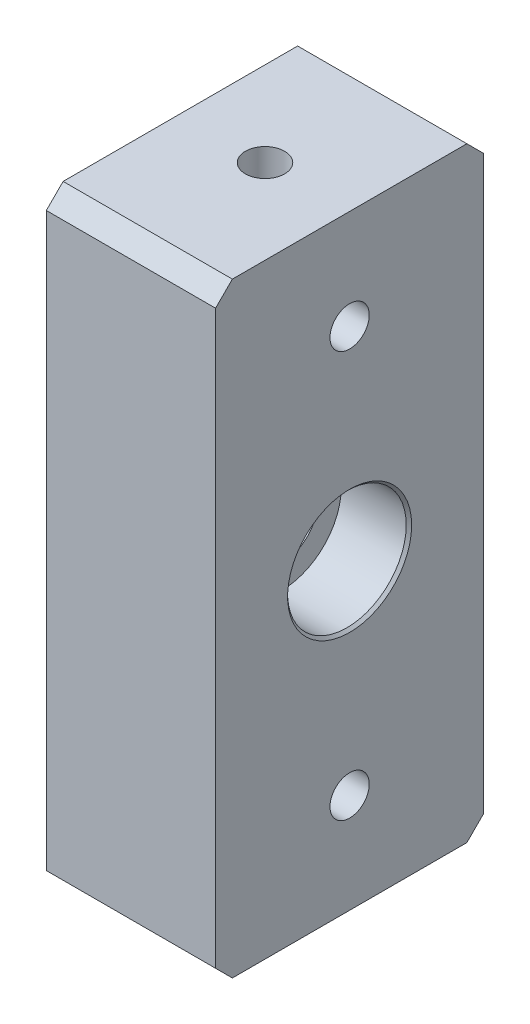
ISO-10303-21;
HEADER;
FILE_DESCRIPTION(('STEP AP214'),'2;1');
FILE_NAME('part.step','',(''),(''),'','','');
FILE_SCHEMA(('AUTOMOTIVE_DESIGN { 1 0 10303 214 1 1 1 1 }'));
ENDSEC;
DATA;
#1=APPLICATION_CONTEXT('core data for automotive mechanical design processes');
#2=APPLICATION_PROTOCOL_DEFINITION('international standard','automotive_design',2000,#1);
#3=PRODUCT_CONTEXT('',#1,'mechanical');
#4=PRODUCT('Part','Part','',(#3));
#5=PRODUCT_RELATED_PRODUCT_CATEGORY('part','',(#4));
#6=PRODUCT_DEFINITION_FORMATION('','',#4);
#7=PRODUCT_DEFINITION_CONTEXT('part definition',#1,'design');
#8=PRODUCT_DEFINITION('design','',#6,#7);
#9=PRODUCT_DEFINITION_SHAPE('','',#8);
#10=(LENGTH_UNIT() NAMED_UNIT(*) SI_UNIT(.MILLI.,.METRE.));
#11=(NAMED_UNIT(*) PLANE_ANGLE_UNIT() SI_UNIT($,.RADIAN.));
#12=(NAMED_UNIT(*) SI_UNIT($,.STERADIAN.) SOLID_ANGLE_UNIT());
#13=UNCERTAINTY_MEASURE_WITH_UNIT(LENGTH_MEASURE(1.E-05),#10,'distance_accuracy_value','');
#14=(GEOMETRIC_REPRESENTATION_CONTEXT(3) GLOBAL_UNCERTAINTY_ASSIGNED_CONTEXT((#13)) GLOBAL_UNIT_ASSIGNED_CONTEXT((#10,
#11,#12)) REPRESENTATION_CONTEXT('',''));
#15=CARTESIAN_POINT('',(0.,0.,0.));
#16=DIRECTION('',(0.,0.,1.));
#17=DIRECTION('',(1.,0.,0.));
#18=AXIS2_PLACEMENT_3D('',#15,#16,#17);
#19=CARTESIAN_POINT('',(7.9375,57.15,12.573));
#20=DIRECTION('',(0.,1.,0.));
#21=DIRECTION('',(0.,0.,1.));
#22=AXIS2_PLACEMENT_3D('',#19,#20,#21);
#23=CYLINDRICAL_SURFACE('',#22,1.8415);
#24=CARTESIAN_POINT('',(7.9375,57.15,12.573));
#25=DIRECTION('',(0.,1.,0.));
#26=DIRECTION('',(0.,0.,1.));
#27=AXIS2_PLACEMENT_3D('',#24,#25,#26);
#28=CIRCLE('',#27,1.8415);
#29=CARTESIAN_POINT('',(7.9375,57.15,14.4145));
#30=VERTEX_POINT('',#29);
#31=EDGE_CURVE('E147',#30,#30,#28,.T.);
#32=ORIENTED_EDGE('',*,*,#31,.T.);
#33=EDGE_LOOP('',(#32));
#34=FACE_BOUND('',#33,.T.);
#35=CARTESIAN_POINT('',(7.9375,47.8155,12.573));
#36=DIRECTION('',(-0.707106781186547,0.707106781186547,0.));
#37=DIRECTION('',(0.707106781186547,0.707106781186547,0.));
#38=AXIS2_PLACEMENT_3D('',#35,#36,#37);
#39=ELLIPSE('',#38,2.60427427511007,1.84150000000001);
#40=CARTESIAN_POINT('',(7.9375,47.8155,10.7315));
#41=VERTEX_POINT('',#40);
#42=CARTESIAN_POINT('',(7.9375,47.8155,14.4145));
#43=VERTEX_POINT('',#42);
#44=EDGE_CURVE('E128',#41,#43,#39,.F.);
#45=ORIENTED_EDGE('',*,*,#44,.T.);
#46=CARTESIAN_POINT('',(7.9375,47.8155,12.573));
#47=DIRECTION('',(0.707106781186547,0.707106781186547,0.));
#48=DIRECTION('',(-0.707106781186547,0.707106781186547,0.));
#49=AXIS2_PLACEMENT_3D('',#46,#47,#48);
#50=ELLIPSE('',#49,2.60427427511007,1.84150000000001);
#51=EDGE_CURVE('E124',#43,#41,#50,.F.);
#52=ORIENTED_EDGE('',*,*,#51,.T.);
#53=EDGE_LOOP('',(#45,#52));
#54=FACE_BOUND('',#53,.T.);
#55=ADVANCED_FACE('F35',(#34,#54),#23,.F.);
#56=CARTESIAN_POINT('',(7.9375,0.381,12.573));
#57=DIRECTION('',(0.,-1.,0.));
#58=DIRECTION('',(0.,0.,-1.));
#59=AXIS2_PLACEMENT_3D('',#56,#57,#58);
#60=CYLINDRICAL_SURFACE('',#59,1.8415);
#61=CARTESIAN_POINT('',(7.9375,0.380999999999999,12.573));
#62=DIRECTION('',(0.,-1.,0.));
#63=DIRECTION('',(0.,0.,-1.));
#64=AXIS2_PLACEMENT_3D('',#61,#62,#63);
#65=CIRCLE('',#64,1.8415);
#66=CARTESIAN_POINT('',(7.9375,0.380999999999999,10.7315));
#67=VERTEX_POINT('',#66);
#68=EDGE_CURVE('E153',#67,#67,#65,.T.);
#69=ORIENTED_EDGE('',*,*,#68,.T.);
#70=EDGE_LOOP('',(#69));
#71=FACE_BOUND('',#70,.T.);
#72=CARTESIAN_POINT('',(7.9375,9.7155,12.573));
#73=DIRECTION('',(-0.707106781186547,-0.707106781186547,0.));
#74=DIRECTION('',(0.707106781186547,-0.707106781186547,0.));
#75=AXIS2_PLACEMENT_3D('',#72,#73,#74);
#76=ELLIPSE('',#75,2.60427427511006,1.84150000000001);
#77=CARTESIAN_POINT('',(7.9375,9.7155,14.4145));
#78=VERTEX_POINT('',#77);
#79=CARTESIAN_POINT('',(7.9375,9.7155,10.7315));
#80=VERTEX_POINT('',#79);
#81=EDGE_CURVE('E172',#78,#80,#76,.F.);
#82=ORIENTED_EDGE('',*,*,#81,.T.);
#83=CARTESIAN_POINT('',(7.9375,9.7155,12.573));
#84=DIRECTION('',(0.707106781186547,-0.707106781186547,0.));
#85=DIRECTION('',(-0.707106781186547,-0.707106781186547,0.));
#86=AXIS2_PLACEMENT_3D('',#83,#84,#85);
#87=ELLIPSE('',#86,2.60427427511006,1.84150000000001);
#88=EDGE_CURVE('E190',#80,#78,#87,.F.);
#89=ORIENTED_EDGE('',*,*,#88,.T.);
#90=EDGE_LOOP('',(#82,#89));
#91=FACE_BOUND('',#90,.T.);
#92=ADVANCED_FACE('F251',(#71,#91),#60,.F.);
#93=CARTESIAN_POINT('',(0.,57.15,0.));
#94=DIRECTION('',(0.,1.,0.));
#95=DIRECTION('',(0.,0.,1.));
#96=AXIS2_PLACEMENT_3D('',#93,#94,#95);
#97=PLANE('',#96);
#98=ORIENTED_EDGE('',*,*,#31,.F.);
#99=EDGE_LOOP('',(#98));
#100=FACE_BOUND('',#99,.T.);
#101=DIRECTION('',(0.,0.,1.));
#102=VECTOR('',#101,1.);
#103=CARTESIAN_POINT('',(0.,57.15,0.));
#104=LINE('',#103,#102);
#105=CARTESIAN_POINT('',(0.,57.15,1.5748));
#106=VERTEX_POINT('',#105);
#107=CARTESIAN_POINT('',(0.,57.15,23.5712));
#108=VERTEX_POINT('',#107);
#109=EDGE_CURVE('E160',#106,#108,#104,.T.);
#110=ORIENTED_EDGE('',*,*,#109,.T.);
#111=DIRECTION('',(1.,0.,0.));
#112=VECTOR('',#111,1.);
#113=CARTESIAN_POINT('',(0.,57.15,23.5712));
#114=LINE('',#113,#112);
#115=CARTESIAN_POINT('',(15.875,57.15,23.5712));
#116=VERTEX_POINT('',#115);
#117=EDGE_CURVE('E198',#108,#116,#114,.T.);
#118=ORIENTED_EDGE('',*,*,#117,.T.);
#119=DIRECTION('',(0.,0.,1.));
#120=VECTOR('',#119,1.);
#121=CARTESIAN_POINT('',(15.875,57.15,0.));
#122=LINE('',#121,#120);
#123=CARTESIAN_POINT('',(15.875,57.15,1.5748));
#124=VERTEX_POINT('',#123);
#125=EDGE_CURVE('E159',#124,#116,#122,.T.);
#126=ORIENTED_EDGE('',*,*,#125,.F.);
#127=DIRECTION('',(-1.,0.,0.));
#128=VECTOR('',#127,1.);
#129=CARTESIAN_POINT('',(0.,57.15,1.5748));
#130=LINE('',#129,#128);
#131=EDGE_CURVE('E193',#124,#106,#130,.T.);
#132=ORIENTED_EDGE('',*,*,#131,.T.);
#133=EDGE_LOOP('',(#110,#118,#126,#132));
#134=FACE_BOUND('',#133,.T.);
#135=ADVANCED_FACE('F257',(#100,#134),#97,.T.);
#136=CARTESIAN_POINT('',(0.,0.380999999999999,0.));
#137=DIRECTION('',(0.,0.,-1.));
#138=DIRECTION('',(-1.,0.,0.));
#139=AXIS2_PLACEMENT_3D('',#136,#137,#138);
#140=PLANE('',#139);
#141=DIRECTION('',(0.,1.,0.));
#142=VECTOR('',#141,1.);
#143=CARTESIAN_POINT('',(0.,0.380999999999999,0.));
#144=LINE('',#143,#142);
#145=CARTESIAN_POINT('',(0.,1.95580000000001,0.));
#146=VERTEX_POINT('',#145);
#147=CARTESIAN_POINT('',(0.,55.5752,0.));
#148=VERTEX_POINT('',#147);
#149=EDGE_CURVE('E169',#146,#148,#144,.T.);
#150=ORIENTED_EDGE('',*,*,#149,.T.);
#151=DIRECTION('',(1.,0.,0.));
#152=VECTOR('',#151,1.);
#153=CARTESIAN_POINT('',(0.,55.5752,0.));
#154=LINE('',#153,#152);
#155=CARTESIAN_POINT('',(15.875,55.5752,0.));
#156=VERTEX_POINT('',#155);
#157=EDGE_CURVE('E223',#148,#156,#154,.T.);
#158=ORIENTED_EDGE('',*,*,#157,.T.);
#159=DIRECTION('',(0.,1.,0.));
#160=VECTOR('',#159,1.);
#161=CARTESIAN_POINT('',(15.875,0.380999999999999,0.));
#162=LINE('',#161,#160);
#163=CARTESIAN_POINT('',(15.875,1.95580000000001,0.));
#164=VERTEX_POINT('',#163);
#165=EDGE_CURVE('E164',#164,#156,#162,.T.);
#166=ORIENTED_EDGE('',*,*,#165,.F.);
#167=DIRECTION('',(-1.,0.,0.));
#168=VECTOR('',#167,1.);
#169=CARTESIAN_POINT('',(0.,1.95580000000001,0.));
#170=LINE('',#169,#168);
#171=EDGE_CURVE('E221',#164,#146,#170,.T.);
#172=ORIENTED_EDGE('',*,*,#171,.T.);
#173=EDGE_LOOP('',(#150,#158,#166,#172));
#174=FACE_BOUND('',#173,.T.);
#175=ADVANCED_FACE('F298',(#174),#140,.T.);
#176=CARTESIAN_POINT('',(0.,0.381,25.146));
#177=DIRECTION('',(0.,-1.,0.));
#178=DIRECTION('',(0.,0.,-1.));
#179=AXIS2_PLACEMENT_3D('',#176,#177,#178);
#180=PLANE('',#179);
#181=ORIENTED_EDGE('',*,*,#68,.F.);
#182=EDGE_LOOP('',(#181));
#183=FACE_BOUND('',#182,.T.);
#184=DIRECTION('',(0.,0.,-1.));
#185=VECTOR('',#184,1.);
#186=CARTESIAN_POINT('',(0.,0.381,25.146));
#187=LINE('',#186,#185);
#188=CARTESIAN_POINT('',(0.,0.381,23.5712));
#189=VERTEX_POINT('',#188);
#190=CARTESIAN_POINT('',(0.,0.380999999999999,1.5748));
#191=VERTEX_POINT('',#190);
#192=EDGE_CURVE('E167',#189,#191,#187,.T.);
#193=ORIENTED_EDGE('',*,*,#192,.T.);
#194=DIRECTION('',(1.,0.,0.));
#195=VECTOR('',#194,1.);
#196=CARTESIAN_POINT('',(0.,0.380999999999999,1.5748));
#197=LINE('',#196,#195);
#198=CARTESIAN_POINT('',(15.875,0.380999999999999,1.5748));
#199=VERTEX_POINT('',#198);
#200=EDGE_CURVE('E227',#191,#199,#197,.T.);
#201=ORIENTED_EDGE('',*,*,#200,.T.);
#202=DIRECTION('',(0.,0.,-1.));
#203=VECTOR('',#202,1.);
#204=CARTESIAN_POINT('',(15.875,0.381,25.146));
#205=LINE('',#204,#203);
#206=CARTESIAN_POINT('',(15.875,0.381,23.5712));
#207=VERTEX_POINT('',#206);
#208=EDGE_CURVE('E178',#207,#199,#205,.T.);
#209=ORIENTED_EDGE('',*,*,#208,.F.);
#210=DIRECTION('',(-1.,0.,0.));
#211=VECTOR('',#210,1.);
#212=CARTESIAN_POINT('',(0.,0.381,23.5712));
#213=LINE('',#212,#211);
#214=EDGE_CURVE('E57',#207,#189,#213,.T.);
#215=ORIENTED_EDGE('',*,*,#214,.T.);
#216=EDGE_LOOP('',(#193,#201,#209,#215));
#217=FACE_BOUND('',#216,.T.);
#218=ADVANCED_FACE('F301',(#183,#217),#180,.T.);
#219=CARTESIAN_POINT('',(0.,57.15,25.146));
#220=DIRECTION('',(0.,0.,1.));
#221=DIRECTION('',(1.,0.,0.));
#222=AXIS2_PLACEMENT_3D('',#219,#220,#221);
#223=PLANE('',#222);
#224=DIRECTION('',(0.,-1.,0.));
#225=VECTOR('',#224,1.);
#226=CARTESIAN_POINT('',(15.875,57.15,25.146));
#227=LINE('',#226,#225);
#228=CARTESIAN_POINT('',(15.875,55.5752,25.146));
#229=VERTEX_POINT('',#228);
#230=CARTESIAN_POINT('',(15.875,1.9558,25.146));
#231=VERTEX_POINT('',#230);
#232=EDGE_CURVE('E175',#229,#231,#227,.T.);
#233=ORIENTED_EDGE('',*,*,#232,.F.);
#234=DIRECTION('',(-1.,0.,0.));
#235=VECTOR('',#234,1.);
#236=CARTESIAN_POINT('',(0.,55.5752,25.146));
#237=LINE('',#236,#235);
#238=CARTESIAN_POINT('',(0.,55.5752,25.146));
#239=VERTEX_POINT('',#238);
#240=EDGE_CURVE('E212',#229,#239,#237,.T.);
#241=ORIENTED_EDGE('',*,*,#240,.T.);
#242=DIRECTION('',(0.,-1.,0.));
#243=VECTOR('',#242,1.);
#244=CARTESIAN_POINT('',(0.,57.15,25.146));
#245=LINE('',#244,#243);
#246=CARTESIAN_POINT('',(0.,1.9558,25.146));
#247=VERTEX_POINT('',#246);
#248=EDGE_CURVE('E163',#239,#247,#245,.T.);
#249=ORIENTED_EDGE('',*,*,#248,.T.);
#250=DIRECTION('',(1.,0.,0.));
#251=VECTOR('',#250,1.);
#252=CARTESIAN_POINT('',(0.,1.9558,25.146));
#253=LINE('',#252,#251);
#254=EDGE_CURVE('E209',#247,#231,#253,.T.);
#255=ORIENTED_EDGE('',*,*,#254,.T.);
#256=EDGE_LOOP('',(#233,#241,#249,#255));
#257=FACE_BOUND('',#256,.T.);
#258=ADVANCED_FACE('F293',(#257),#223,.T.);
#259=CARTESIAN_POINT('',(0.,0.,0.));
#260=DIRECTION('',(1.,0.,0.));
#261=DIRECTION('',(0.,0.,-1.));
#262=AXIS2_PLACEMENT_3D('',#259,#260,#261);
#263=PLANE('',#262);
#264=CARTESIAN_POINT('',(0.,28.7655,12.573));
#265=DIRECTION('',(1.,0.,0.));
#266=DIRECTION('',(0.,0.,-1.));
#267=AXIS2_PLACEMENT_3D('',#264,#265,#266);
#268=CIRCLE('',#267,3.63220000021137);
#269=CARTESIAN_POINT('',(0.,28.7655,16.2052000002114));
#270=VERTEX_POINT('',#269);
#271=EDGE_CURVE('E230',#270,#270,#268,.T.);
#272=ORIENTED_EDGE('',*,*,#271,.T.);
#273=EDGE_LOOP('',(#272));
#274=FACE_BOUND('',#273,.T.);
#275=CARTESIAN_POINT('',(0.,47.8155,12.573));
#276=DIRECTION('',(1.,0.,0.));
#277=DIRECTION('',(0.,0.,-1.));
#278=AXIS2_PLACEMENT_3D('',#275,#276,#277);
#279=CIRCLE('',#278,1.84150000000002);
#280=CARTESIAN_POINT('',(0.,47.8155,10.7315));
#281=VERTEX_POINT('',#280);
#282=EDGE_CURVE('E134',#281,#281,#279,.T.);
#283=ORIENTED_EDGE('',*,*,#282,.T.);
#284=EDGE_LOOP('',(#283));
#285=FACE_BOUND('',#284,.T.);
#286=CARTESIAN_POINT('',(0.,9.7155,12.573));
#287=DIRECTION('',(1.,0.,0.));
#288=DIRECTION('',(0.,0.,-1.));
#289=AXIS2_PLACEMENT_3D('',#286,#287,#288);
#290=CIRCLE('',#289,1.84150000000002);
#291=CARTESIAN_POINT('',(0.,9.7155,10.7315));
#292=VERTEX_POINT('',#291);
#293=EDGE_CURVE('E144',#292,#292,#290,.T.);
#294=ORIENTED_EDGE('',*,*,#293,.T.);
#295=EDGE_LOOP('',(#294));
#296=FACE_BOUND('',#295,.T.);
#297=ORIENTED_EDGE('',*,*,#248,.F.);
#298=DIRECTION('',(0.,-0.707106781186551,0.707106781186544));
#299=VECTOR('',#298,1.);
#300=CARTESIAN_POINT('',(0.,57.15,23.5712));
#301=LINE('',#300,#299);
#302=EDGE_CURVE('E219',#239,#108,#301,.F.);
#303=ORIENTED_EDGE('',*,*,#302,.T.);
#304=ORIENTED_EDGE('',*,*,#109,.F.);
#305=DIRECTION('',(0.,0.707106781186544,0.707106781186551));
#306=VECTOR('',#305,1.);
#307=CARTESIAN_POINT('',(0.,55.5752,0.));
#308=LINE('',#307,#306);
#309=EDGE_CURVE('E217',#106,#148,#308,.F.);
#310=ORIENTED_EDGE('',*,*,#309,.T.);
#311=ORIENTED_EDGE('',*,*,#149,.F.);
#312=DIRECTION('',(0.,0.707106781186551,-0.707106781186544));
#313=VECTOR('',#312,1.);
#314=CARTESIAN_POINT('',(0.,0.380999999999999,1.5748));
#315=LINE('',#314,#313);
#316=EDGE_CURVE('E50',#146,#191,#315,.F.);
#317=ORIENTED_EDGE('',*,*,#316,.T.);
#318=ORIENTED_EDGE('',*,*,#192,.F.);
#319=DIRECTION('',(0.,-0.707106781186544,-0.707106781186551));
#320=VECTOR('',#319,1.);
#321=CARTESIAN_POINT('',(0.,1.9558,25.146));
#322=LINE('',#321,#320);
#323=EDGE_CURVE('E214',#189,#247,#322,.F.);
#324=ORIENTED_EDGE('',*,*,#323,.T.);
#325=EDGE_LOOP('',(#297,#303,#304,#310,#311,#317,#318,#324));
#326=FACE_BOUND('',#325,.T.);
#327=ADVANCED_FACE('F289',(#274,#285,#296,#326),#263,.F.);
#328=CARTESIAN_POINT('',(15.875,0.,0.));
#329=DIRECTION('',(1.,0.,0.));
#330=DIRECTION('',(0.,0.,-1.));
#331=AXIS2_PLACEMENT_3D('',#328,#329,#330);
#332=PLANE('',#331);
#333=CARTESIAN_POINT('',(15.875,28.7655,12.573));
#334=DIRECTION('',(1.,0.,0.));
#335=DIRECTION('',(0.,0.,-1.));
#336=AXIS2_PLACEMENT_3D('',#333,#334,#335);
#337=CIRCLE('',#336,5.81659999975662);
#338=CARTESIAN_POINT('',(15.875,28.7655,6.75640000024338));
#339=VERTEX_POINT('',#338);
#340=EDGE_CURVE('E11',#339,#339,#337,.F.);
#341=ORIENTED_EDGE('',*,*,#340,.T.);
#342=EDGE_LOOP('',(#341));
#343=FACE_BOUND('',#342,.T.);
#344=CARTESIAN_POINT('',(15.875,47.8155,12.573));
#345=DIRECTION('',(1.,0.,0.));
#346=DIRECTION('',(0.,0.,-1.));
#347=AXIS2_PLACEMENT_3D('',#344,#345,#346);
#348=CIRCLE('',#347,1.84150000000002);
#349=CARTESIAN_POINT('',(15.875,47.8155,10.7315));
#350=VERTEX_POINT('',#349);
#351=EDGE_CURVE('E196',#350,#350,#348,.T.);
#352=ORIENTED_EDGE('',*,*,#351,.F.);
#353=EDGE_LOOP('',(#352));
#354=FACE_BOUND('',#353,.T.);
#355=CARTESIAN_POINT('',(15.875,9.7155,12.573));
#356=DIRECTION('',(1.,0.,0.));
#357=DIRECTION('',(0.,0.,-1.));
#358=AXIS2_PLACEMENT_3D('',#355,#356,#357);
#359=CIRCLE('',#358,1.84150000000002);
#360=CARTESIAN_POINT('',(15.875,9.7155,10.7315));
#361=VERTEX_POINT('',#360);
#362=EDGE_CURVE('E136',#361,#361,#359,.T.);
#363=ORIENTED_EDGE('',*,*,#362,.F.);
#364=EDGE_LOOP('',(#363));
#365=FACE_BOUND('',#364,.T.);
#366=ORIENTED_EDGE('',*,*,#125,.T.);
#367=DIRECTION('',(0.,0.707106781186551,-0.707106781186544));
#368=VECTOR('',#367,1.);
#369=CARTESIAN_POINT('',(15.875,40.3605999999998,40.3606000000001));
#370=LINE('',#369,#368);
#371=EDGE_CURVE('E207',#116,#229,#370,.F.);
#372=ORIENTED_EDGE('',*,*,#371,.T.);
#373=ORIENTED_EDGE('',*,*,#232,.T.);
#374=DIRECTION('',(0.,0.707106781186544,0.707106781186551));
#375=VECTOR('',#374,1.);
#376=CARTESIAN_POINT('',(15.875,-11.5951,11.5950999999999));
#377=LINE('',#376,#375);
#378=EDGE_CURVE('E201',#231,#207,#377,.F.);
#379=ORIENTED_EDGE('',*,*,#378,.T.);
#380=ORIENTED_EDGE('',*,*,#208,.T.);
#381=DIRECTION('',(0.,-0.707106781186551,0.707106781186544));
#382=VECTOR('',#381,1.);
#383=CARTESIAN_POINT('',(15.875,0.977899999999999,0.977900000000007));
#384=LINE('',#383,#382);
#385=EDGE_CURVE('E203',#199,#164,#384,.F.);
#386=ORIENTED_EDGE('',*,*,#385,.T.);
#387=ORIENTED_EDGE('',*,*,#165,.T.);
#388=DIRECTION('',(0.,-0.707106781186544,-0.707106781186551));
#389=VECTOR('',#388,1.);
#390=CARTESIAN_POINT('',(15.875,27.7876000000003,-27.7876));
#391=LINE('',#390,#389);
#392=EDGE_CURVE('E205',#156,#124,#391,.F.);
#393=ORIENTED_EDGE('',*,*,#392,.T.);
#394=EDGE_LOOP('',(#366,#372,#373,#379,#380,#386,#387,#393));
#395=FACE_BOUND('',#394,.T.);
#396=ADVANCED_FACE('F292',(#343,#354,#365,#395),#332,.T.);
#397=CARTESIAN_POINT('',(15.875,9.7155,12.573));
#398=DIRECTION('',(1.,0.,0.));
#399=DIRECTION('',(0.,0.,-1.));
#400=AXIS2_PLACEMENT_3D('',#397,#398,#399);
#401=CYLINDRICAL_SURFACE('',#400,1.84150000000002);
#402=ORIENTED_EDGE('',*,*,#362,.T.);
#403=EDGE_LOOP('',(#402));
#404=FACE_BOUND('',#403,.T.);
#405=ORIENTED_EDGE('',*,*,#81,.F.);
#406=CARTESIAN_POINT('',(7.9375,9.7155,12.573));
#407=DIRECTION('',(0.707106781186547,-0.707106781186547,0.));
#408=DIRECTION('',(-0.707106781186547,-0.707106781186547,0.));
#409=AXIS2_PLACEMENT_3D('',#406,#407,#408);
#410=ELLIPSE('',#409,2.60427427511006,1.84150000000001);
#411=EDGE_CURVE('E187',#80,#78,#410,.T.);
#412=ORIENTED_EDGE('',*,*,#411,.F.);
#413=EDGE_LOOP('',(#405,#412));
#414=FACE_BOUND('',#413,.T.);
#415=ADVANCED_FACE('F287',(#404,#414),#401,.F.);
#416=CARTESIAN_POINT('',(7.9375,13.081,12.573));
#417=DIRECTION('',(0.,-1.,0.));
#418=DIRECTION('',(0.,0.,-1.));
#419=AXIS2_PLACEMENT_3D('',#416,#417,#418);
#420=CONICAL_SURFACE('',#419,1.8415,1.02974425741709);
#421=CARTESIAN_POINT('',(7.9375,14.1874848330962,12.573));
#422=VERTEX_POINT('',#421);
#423=VERTEX_LOOP('',#422);
#424=FACE_BOUND('',#423,.T.);
#425=CARTESIAN_POINT('',(7.9375,13.081,12.573));
#426=DIRECTION('',(0.,-1.,0.));
#427=DIRECTION('',(0.,0.,-1.));
#428=AXIS2_PLACEMENT_3D('',#425,#426,#427);
#429=CIRCLE('',#428,1.8415);
#430=CARTESIAN_POINT('',(7.9375,13.081,10.7315));
#431=VERTEX_POINT('',#430);
#432=EDGE_CURVE('E156',#431,#431,#429,.T.);
#433=ORIENTED_EDGE('',*,*,#432,.T.);
#434=EDGE_LOOP('',(#433));
#435=FACE_BOUND('',#434,.T.);
#436=ADVANCED_FACE('F283',(#424,#435),#420,.F.);
#437=CARTESIAN_POINT('',(7.9375,9.7155,12.573));
#438=DIRECTION('',(-0.707106781186547,-0.707106781186547,0.));
#439=DIRECTION('',(0.707106781186547,-0.707106781186547,0.));
#440=AXIS2_PLACEMENT_3D('',#437,#438,#439);
#441=ELLIPSE('',#440,2.60427427511006,1.84150000000001);
#442=EDGE_CURVE('E184',#78,#80,#441,.T.);
#443=ORIENTED_EDGE('',*,*,#442,.T.);
#444=ORIENTED_EDGE('',*,*,#411,.T.);
#445=EDGE_LOOP('',(#443,#444));
#446=FACE_BOUND('',#445,.T.);
#447=ORIENTED_EDGE('',*,*,#432,.F.);
#448=EDGE_LOOP('',(#447));
#449=FACE_BOUND('',#448,.T.);
#450=ADVANCED_FACE('F260',(#446,#449),#60,.F.);
#451=ORIENTED_EDGE('',*,*,#442,.F.);
#452=ORIENTED_EDGE('',*,*,#88,.F.);
#453=EDGE_LOOP('',(#451,#452));
#454=FACE_BOUND('',#453,.T.);
#455=ORIENTED_EDGE('',*,*,#293,.F.);
#456=EDGE_LOOP('',(#455));
#457=FACE_BOUND('',#456,.T.);
#458=ADVANCED_FACE('F282',(#454,#457),#401,.F.);
#459=CARTESIAN_POINT('',(15.875,47.8155,12.573));
#460=DIRECTION('',(1.,0.,0.));
#461=DIRECTION('',(0.,0.,-1.));
#462=AXIS2_PLACEMENT_3D('',#459,#460,#461);
#463=CYLINDRICAL_SURFACE('',#462,1.84150000000002);
#464=ORIENTED_EDGE('',*,*,#282,.F.);
#465=EDGE_LOOP('',(#464));
#466=FACE_BOUND('',#465,.T.);
#467=CARTESIAN_POINT('',(7.9375,47.8155,12.573));
#468=DIRECTION('',(-0.707106781186547,0.707106781186547,0.));
#469=DIRECTION('',(0.707106781186547,0.707106781186547,0.));
#470=AXIS2_PLACEMENT_3D('',#467,#468,#469);
#471=ELLIPSE('',#470,2.60427427511007,1.84150000000001);
#472=EDGE_CURVE('E120',#41,#43,#471,.T.);
#473=ORIENTED_EDGE('',*,*,#472,.F.);
#474=ORIENTED_EDGE('',*,*,#51,.F.);
#475=EDGE_LOOP('',(#473,#474));
#476=FACE_BOUND('',#475,.T.);
#477=ADVANCED_FACE('F122',(#466,#476),#463,.F.);
#478=ORIENTED_EDGE('',*,*,#351,.T.);
#479=EDGE_LOOP('',(#478));
#480=FACE_BOUND('',#479,.T.);
#481=ORIENTED_EDGE('',*,*,#44,.F.);
#482=CARTESIAN_POINT('',(7.9375,47.8155,12.573));
#483=DIRECTION('',(0.707106781186547,0.707106781186547,0.));
#484=DIRECTION('',(-0.707106781186547,0.707106781186547,0.));
#485=AXIS2_PLACEMENT_3D('',#482,#483,#484);
#486=ELLIPSE('',#485,2.60427427511007,1.84150000000001);
#487=EDGE_CURVE('E127',#43,#41,#486,.T.);
#488=ORIENTED_EDGE('',*,*,#487,.F.);
#489=EDGE_LOOP('',(#481,#488));
#490=FACE_BOUND('',#489,.T.);
#491=ADVANCED_FACE('F132',(#480,#490),#463,.F.);
#492=CARTESIAN_POINT('',(7.9375,44.45,12.573));
#493=DIRECTION('',(0.,1.,0.));
#494=DIRECTION('',(0.,0.,1.));
#495=AXIS2_PLACEMENT_3D('',#492,#493,#494);
#496=CONICAL_SURFACE('',#495,1.8415,1.02974425748207);
#497=CARTESIAN_POINT('',(7.9375,43.3435151670667,12.573));
#498=VERTEX_POINT('',#497);
#499=VERTEX_LOOP('',#498);
#500=FACE_BOUND('',#499,.T.);
#501=CARTESIAN_POINT('',(7.9375,44.45,12.573));
#502=DIRECTION('',(0.,1.,0.));
#503=DIRECTION('',(0.,0.,1.));
#504=AXIS2_PLACEMENT_3D('',#501,#502,#503);
#505=CIRCLE('',#504,1.8415);
#506=CARTESIAN_POINT('',(7.9375,44.45,14.4145));
#507=VERTEX_POINT('',#506);
#508=EDGE_CURVE('E150',#507,#507,#505,.T.);
#509=ORIENTED_EDGE('',*,*,#508,.T.);
#510=EDGE_LOOP('',(#509));
#511=FACE_BOUND('',#510,.T.);
#512=ADVANCED_FACE('F265',(#500,#511),#496,.F.);
#513=ORIENTED_EDGE('',*,*,#472,.T.);
#514=ORIENTED_EDGE('',*,*,#487,.T.);
#515=EDGE_LOOP('',(#513,#514));
#516=FACE_BOUND('',#515,.T.);
#517=ORIENTED_EDGE('',*,*,#508,.F.);
#518=EDGE_LOOP('',(#517));
#519=FACE_BOUND('',#518,.T.);
#520=ADVANCED_FACE('F138',(#516,#519),#23,.F.);
#521=CARTESIAN_POINT('',(15.875,28.7655,12.573));
#522=DIRECTION('',(1.,0.,0.));
#523=DIRECTION('',(0.,0.,-1.));
#524=AXIS2_PLACEMENT_3D('',#521,#522,#523);
#525=CYLINDRICAL_SURFACE('',#524,3.37820000000001);
#526=CARTESIAN_POINT('',(0.25399999975661,28.7655,12.573));
#527=DIRECTION('',(1.,0.,0.));
#528=DIRECTION('',(0.,0.,-1.));
#529=AXIS2_PLACEMENT_3D('',#526,#527,#528);
#530=CIRCLE('',#529,3.37820000000001);
#531=CARTESIAN_POINT('',(0.25399999975661,28.7655,15.9512));
#532=VERTEX_POINT('',#531);
#533=EDGE_CURVE('E233',#532,#532,#530,.F.);
#534=ORIENTED_EDGE('',*,*,#533,.T.);
#535=EDGE_LOOP('',(#534));
#536=FACE_BOUND('',#535,.T.);
#537=CARTESIAN_POINT('',(9.525,28.7655,12.573));
#538=DIRECTION('',(1.,0.,0.));
#539=DIRECTION('',(0.,0.,-1.));
#540=AXIS2_PLACEMENT_3D('',#537,#538,#539);
#541=CIRCLE('',#540,3.37820000000001);
#542=CARTESIAN_POINT('',(9.525,28.7655,9.19479999999999));
#543=VERTEX_POINT('',#542);
#544=EDGE_CURVE('E465',#543,#543,#541,.T.);
#545=ORIENTED_EDGE('',*,*,#544,.T.);
#546=EDGE_LOOP('',(#545));
#547=FACE_BOUND('',#546,.T.);
#548=ADVANCED_FACE('F264',(#536,#547),#525,.F.);
#549=CARTESIAN_POINT('',(9.525,32.1437,12.573));
#550=DIRECTION('',(-1.,0.,0.));
#551=DIRECTION('',(0.,0.,1.));
#552=AXIS2_PLACEMENT_3D('',#549,#550,#551);
#553=PLANE('',#552);
#554=ORIENTED_EDGE('',*,*,#544,.F.);
#555=EDGE_LOOP('',(#554));
#556=FACE_BOUND('',#555,.T.);
#557=CARTESIAN_POINT('',(9.525,28.7655,12.573));
#558=DIRECTION('',(1.,0.,0.));
#559=DIRECTION('',(0.,0.,-1.));
#560=AXIS2_PLACEMENT_3D('',#557,#558,#559);
#561=CIRCLE('',#560,5.5626);
#562=CARTESIAN_POINT('',(9.525,28.7655,7.0104));
#563=VERTEX_POINT('',#562);
#564=EDGE_CURVE('E468',#563,#563,#561,.T.);
#565=ORIENTED_EDGE('',*,*,#564,.T.);
#566=EDGE_LOOP('',(#565));
#567=FACE_BOUND('',#566,.T.);
#568=ADVANCED_FACE('F270',(#556,#567),#553,.F.);
#569=CARTESIAN_POINT('',(15.875,28.7655,12.573));
#570=DIRECTION('',(1.,0.,0.));
#571=DIRECTION('',(0.,0.,-1.));
#572=AXIS2_PLACEMENT_3D('',#569,#570,#571);
#573=CYLINDRICAL_SURFACE('',#572,5.5626);
#574=CARTESIAN_POINT('',(15.6209999997886,28.7655,12.573));
#575=DIRECTION('',(1.,0.,0.));
#576=DIRECTION('',(0.,0.,-1.));
#577=AXIS2_PLACEMENT_3D('',#574,#575,#576);
#578=CIRCLE('',#577,5.5626);
#579=CARTESIAN_POINT('',(15.6209999997886,28.7655,7.0104));
#580=VERTEX_POINT('',#579);
#581=EDGE_CURVE('E43',#580,#580,#578,.T.);
#582=ORIENTED_EDGE('',*,*,#581,.T.);
#583=EDGE_LOOP('',(#582));
#584=FACE_BOUND('',#583,.T.);
#585=ORIENTED_EDGE('',*,*,#564,.F.);
#586=EDGE_LOOP('',(#585));
#587=FACE_BOUND('',#586,.T.);
#588=ADVANCED_FACE('F238',(#584,#587),#573,.F.);
#589=CARTESIAN_POINT('',(0.,57.15,23.5712));
#590=DIRECTION('',(0.,-0.707106781186544,-0.707106781186551));
#591=DIRECTION('',(1.,0.,0.));
#592=AXIS2_PLACEMENT_3D('',#589,#590,#591);
#593=PLANE('',#592);
#594=ORIENTED_EDGE('',*,*,#302,.F.);
#595=ORIENTED_EDGE('',*,*,#240,.F.);
#596=ORIENTED_EDGE('',*,*,#371,.F.);
#597=ORIENTED_EDGE('',*,*,#117,.F.);
#598=EDGE_LOOP('',(#594,#595,#596,#597));
#599=FACE_BOUND('',#598,.T.);
#600=ADVANCED_FACE('F312',(#599),#593,.F.);
#601=CARTESIAN_POINT('',(0.,55.5752,0.));
#602=DIRECTION('',(0.,-0.707106781186551,0.707106781186544));
#603=DIRECTION('',(1.,0.,0.));
#604=AXIS2_PLACEMENT_3D('',#601,#602,#603);
#605=PLANE('',#604);
#606=ORIENTED_EDGE('',*,*,#309,.F.);
#607=ORIENTED_EDGE('',*,*,#131,.F.);
#608=ORIENTED_EDGE('',*,*,#392,.F.);
#609=ORIENTED_EDGE('',*,*,#157,.F.);
#610=EDGE_LOOP('',(#606,#607,#608,#609));
#611=FACE_BOUND('',#610,.T.);
#612=ADVANCED_FACE('F315',(#611),#605,.F.);
#613=CARTESIAN_POINT('',(0.,0.380999999999999,1.5748));
#614=DIRECTION('',(0.,0.707106781186544,0.707106781186551));
#615=DIRECTION('',(1.,0.,0.));
#616=AXIS2_PLACEMENT_3D('',#613,#614,#615);
#617=PLANE('',#616);
#618=ORIENTED_EDGE('',*,*,#316,.F.);
#619=ORIENTED_EDGE('',*,*,#171,.F.);
#620=ORIENTED_EDGE('',*,*,#385,.F.);
#621=ORIENTED_EDGE('',*,*,#200,.F.);
#622=EDGE_LOOP('',(#618,#619,#620,#621));
#623=FACE_BOUND('',#622,.T.);
#624=ADVANCED_FACE('F319',(#623),#617,.F.);
#625=CARTESIAN_POINT('',(0.,1.9558,25.146));
#626=DIRECTION('',(0.,0.707106781186551,-0.707106781186544));
#627=DIRECTION('',(1.,0.,0.));
#628=AXIS2_PLACEMENT_3D('',#625,#626,#627);
#629=PLANE('',#628);
#630=ORIENTED_EDGE('',*,*,#323,.F.);
#631=ORIENTED_EDGE('',*,*,#214,.F.);
#632=ORIENTED_EDGE('',*,*,#378,.F.);
#633=ORIENTED_EDGE('',*,*,#254,.F.);
#634=EDGE_LOOP('',(#630,#631,#632,#633));
#635=FACE_BOUND('',#634,.T.);
#636=ADVANCED_FACE('F247',(#635),#629,.F.);
#637=CARTESIAN_POINT('',(0.,28.7655,12.573));
#638=DIRECTION('',(-1.,0.,0.));
#639=DIRECTION('',(0.,0.,1.));
#640=AXIS2_PLACEMENT_3D('',#637,#638,#639);
#641=CONICAL_SURFACE('',#640,3.63220000021137,0.785398164292624);
#642=CARTESIAN_POINT('',(0.25399999975661,28.7655,15.9512));
#643=CARTESIAN_POINT('',(0.251354166425812,28.7655,15.9538458333355));
#644=CARTESIAN_POINT('',(0.248708333095014,28.7655,15.9564916666711));
#645=CARTESIAN_POINT('',(0.243416666433418,28.7655,15.9617833333421));
#646=CARTESIAN_POINT('',(0.24077083310262,28.7655,15.9644291666777));
#647=CARTESIAN_POINT('',(0.235479166441024,28.7655,15.9697208333488));
#648=CARTESIAN_POINT('',(0.232833333110226,28.7655,15.9723666666843));
#649=CARTESIAN_POINT('',(0.22754166644863,28.7655,15.9776583333554));
#650=CARTESIAN_POINT('',(0.224895833117832,28.7655,15.9803041666909));
#651=CARTESIAN_POINT('',(0.219604166456236,28.7655,15.985595833362));
#652=CARTESIAN_POINT('',(0.216958333125438,28.7655,15.9882416666975));
#653=CARTESIAN_POINT('',(0.211666666463842,28.7655,15.9935333333686));
#654=CARTESIAN_POINT('',(0.209020833133044,28.7655,15.9961791667041));
#655=CARTESIAN_POINT('',(0.203729166471448,28.7655,16.0014708333752));
#656=CARTESIAN_POINT('',(0.20108333314065,28.7655,16.0041166667107));
#657=CARTESIAN_POINT('',(0.195791666479054,28.7655,16.0094083333818));
#658=CARTESIAN_POINT('',(0.193145833148256,28.7655,16.0120541667173));
#659=CARTESIAN_POINT('',(0.18785416648666,28.7655,16.0173458333884));
#660=CARTESIAN_POINT('',(0.185208333155862,28.7655,16.0199916667239));
#661=CARTESIAN_POINT('',(0.179916666494266,28.7655,16.025283333395));
#662=CARTESIAN_POINT('',(0.177270833163468,28.7655,16.0279291667305));
#663=CARTESIAN_POINT('',(0.171979166501872,28.7655,16.0332208334016));
#664=CARTESIAN_POINT('',(0.169333333171074,28.7655,16.0358666667371));
#665=CARTESIAN_POINT('',(0.164041666509477,28.7655,16.0411583334082));
#666=CARTESIAN_POINT('',(0.161395833178679,28.7655,16.0438041667437));
#667=CARTESIAN_POINT('',(0.156104166517084,28.7655,16.0490958334148));
#668=CARTESIAN_POINT('',(0.153458333186286,28.7655,16.0517416667503));
#669=CARTESIAN_POINT('',(0.14816666652469,28.7655,16.0570333334214));
#670=CARTESIAN_POINT('',(0.145520833193891,28.7655,16.0596791667569));
#671=CARTESIAN_POINT('',(0.140229166532295,28.7655,16.064970833428));
#672=CARTESIAN_POINT('',(0.137583333201497,28.7655,16.0676166667635));
#673=CARTESIAN_POINT('',(0.132291666539901,28.7655,16.0729083334346));
#674=CARTESIAN_POINT('',(0.129645833209103,28.7655,16.0755541667702));
#675=CARTESIAN_POINT('',(0.124354166547507,28.7655,16.0808458334412));
#676=CARTESIAN_POINT('',(0.121708333216709,28.7655,16.0834916667768));
#677=CARTESIAN_POINT('',(0.116416666555113,28.7655,16.0887833334478));
#678=CARTESIAN_POINT('',(0.113770833224315,28.7655,16.0914291667834));
#679=CARTESIAN_POINT('',(0.108479166562719,28.7655,16.0967208334544));
#680=CARTESIAN_POINT('',(0.105833333231921,28.7655,16.09936666679));
#681=CARTESIAN_POINT('',(0.100541666570325,28.7655,16.104658333461));
#682=CARTESIAN_POINT('',(0.0978958332395269,28.7655,16.1073041667966));
#683=CARTESIAN_POINT('',(0.0926041665779308,28.7655,16.1125958334676));
#684=CARTESIAN_POINT('',(0.0899583332471328,28.7655,16.1152416668032));
#685=CARTESIAN_POINT('',(0.0846666665855368,28.7655,16.1205333334742));
#686=CARTESIAN_POINT('',(0.0820208332547388,28.7655,16.1231791668098));
#687=CARTESIAN_POINT('',(0.0767291665931427,28.7655,16.1284708334809));
#688=CARTESIAN_POINT('',(0.0740833332623447,28.7655,16.1311166668164));
#689=CARTESIAN_POINT('',(0.0687916666007486,28.7655,16.1364083334875));
#690=CARTESIAN_POINT('',(0.0661458332699506,28.7655,16.139054166823));
#691=CARTESIAN_POINT('',(0.0608541666083546,28.7655,16.1443458334941));
#692=CARTESIAN_POINT('',(0.0582083332775565,28.7655,16.1469916668296));
#693=CARTESIAN_POINT('',(0.0529166666159605,28.7655,16.1522833335007));
#694=CARTESIAN_POINT('',(0.0502708332851625,28.7655,16.1549291668362));
#695=CARTESIAN_POINT('',(0.0449791666235664,28.7655,16.1602208335073));
#696=CARTESIAN_POINT('',(0.0423333332927684,28.7655,16.1628666668428));
#697=CARTESIAN_POINT('',(0.0370416666311723,28.7655,16.1681583335139));
#698=CARTESIAN_POINT('',(0.0343958333003743,28.7655,16.1708041668494));
#699=CARTESIAN_POINT('',(0.0291041666387783,28.7655,16.1760958335205));
#700=CARTESIAN_POINT('',(0.0264583333079802,28.7655,16.178741666856));
#701=CARTESIAN_POINT('',(0.0211666666463842,28.7655,16.1840333335271));
#702=CARTESIAN_POINT('',(0.0185208333155862,28.7655,16.1866791668626));
#703=CARTESIAN_POINT('',(0.0132291666539901,28.7655,16.1919708335337));
#704=CARTESIAN_POINT('',(0.0105833333231921,28.7655,16.1946166668692));
#705=CARTESIAN_POINT('',(0.00529166666159605,28.7655,16.1999083335403));
#706=CARTESIAN_POINT('',(0.00264583333079803,28.7655,16.2025541668758));
#707=CARTESIAN_POINT('',(0.,28.7655,16.2052000002114));
#708=B_SPLINE_CURVE_WITH_KNOTS('',3,(#642,#643,#644,#645,#646,#647,#648,#649,#650,#651,#652,
#653,#654,#655,#656,#657,#658,#659,#660,#661,#662,#663,#664,#665,#666,#667,#668,#669,#670,#671,
#672,#673,#674,#675,#676,#677,#678,#679,#680,#681,#682,#683,#684,#685,#686,#687,#688,#689,#690,
#691,#692,#693,#694,#695,#696,#697,#698,#699,#700,#701,#702,#703,#704,#705,#706,#707),
.UNSPECIFIED.,.F.,.F.,(4,2,2,2,2,2,2,2,2,2,2,2,2,2,2,2,2,2,2,2,2,2,2,2,2,2,2,2,2,2,2,2,4),(0.,
0.0112253201506287,0.0224506403012575,0.0336759604518862,0.044901280602515,0.0561266007531437,
0.0673519209037725,0.0785772410544012,0.08980256120503,0.101027881355659,0.112253201506287,
0.123478521656916,0.134703841807545,0.145929161958174,0.1571544821088,0.168379802259429,
0.179605122410057,0.190830442560686,0.202055762711315,0.213281082861944,0.224506403012572,
0.235731723163201,0.24695704331383,0.258182363464459,0.269407683615087,0.280633003765716,
0.291858323916345,0.303083644066973,0.314308964217602,0.325534284368231,0.33675960451886,
0.347984924669488,0.359210244820117),.UNSPECIFIED.);
#709=EDGE_CURVE('BSEAM242',#532,#270,#708,.T.);
#710=ORIENTED_EDGE('',*,*,#533,.F.);
#711=ORIENTED_EDGE('',*,*,#271,.F.);
#712=ORIENTED_EDGE('',*,*,#709,.T.);
#713=ORIENTED_EDGE('',*,*,#709,.F.);
#714=EDGE_LOOP('',(#710,#712,#711,#713));
#715=FACE_BOUND('',#714,.T.);
#716=ADVANCED_FACE('F242',(#715),#641,.F.);
#717=CARTESIAN_POINT('',(15.6209999997886,28.7655,12.573));
#718=DIRECTION('',(1.,0.,0.));
#719=DIRECTION('',(0.,0.,-1.));
#720=AXIS2_PLACEMENT_3D('',#717,#718,#719);
#721=CONICAL_SURFACE('',#720,5.5626,0.785398162502297);
#722=ORIENTED_EDGE('',*,*,#340,.F.);
#723=EDGE_LOOP('',(#722));
#724=FACE_BOUND('',#723,.T.);
#725=ORIENTED_EDGE('',*,*,#581,.F.);
#726=EDGE_LOOP('',(#725));
#727=FACE_BOUND('',#726,.T.);
#728=ADVANCED_FACE('F37',(#724,#727),#721,.F.);
#729=CLOSED_SHELL('',(#55,#92,#135,#175,#218,#258,#327,#396,#415,#436,#450,#458,#477,#491,#512,
#520,#548,#568,#588,#600,#612,#624,#636,#716,#728));
#730=MANIFOLD_SOLID_BREP('B2',#729);
#731=ADVANCED_BREP_SHAPE_REPRESENTATION('',(#18,#730),#14);
#732=SHAPE_DEFINITION_REPRESENTATION(#9,#731);
ENDSEC;
END-ISO-10303-21;
